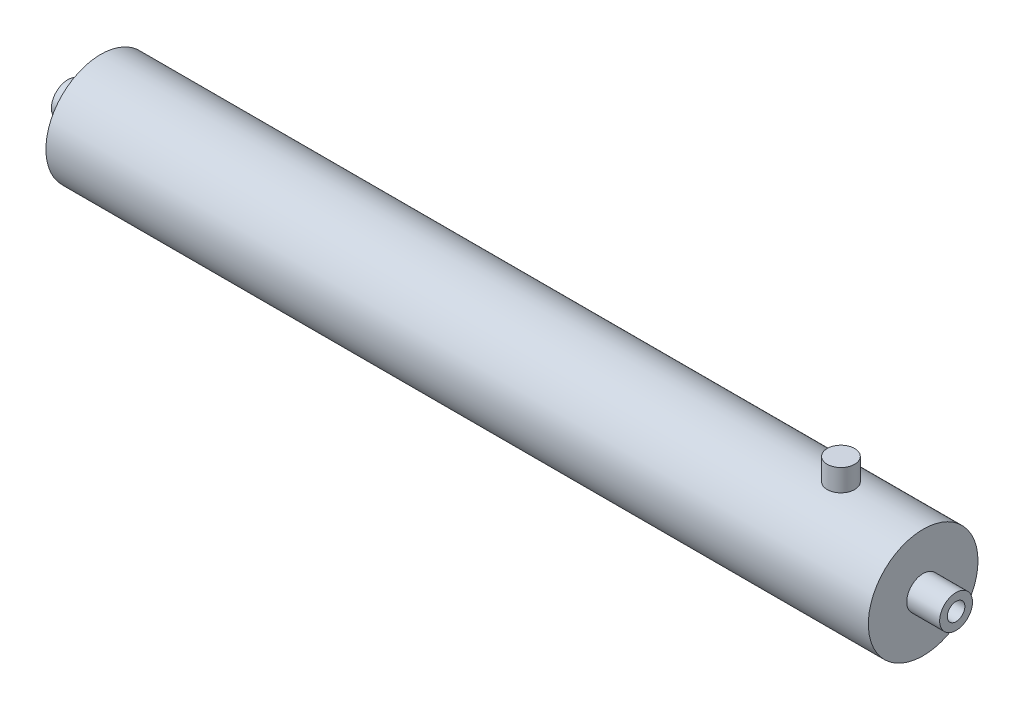
ISO-10303-21;
HEADER;
FILE_DESCRIPTION(('STEP AP214'),'2;1');
FILE_NAME('part.step','',(''),(''),'','','');
FILE_SCHEMA(('AUTOMOTIVE_DESIGN { 1 0 10303 214 1 1 1 1 }'));
ENDSEC;
DATA;
#1=APPLICATION_CONTEXT('core data for automotive mechanical design processes');
#2=APPLICATION_PROTOCOL_DEFINITION('international standard','automotive_design',2000,#1);
#3=PRODUCT_CONTEXT('',#1,'mechanical');
#4=PRODUCT('Part','Part','',(#3));
#5=PRODUCT_RELATED_PRODUCT_CATEGORY('part','',(#4));
#6=PRODUCT_DEFINITION_FORMATION('','',#4);
#7=PRODUCT_DEFINITION_CONTEXT('part definition',#1,'design');
#8=PRODUCT_DEFINITION('design','',#6,#7);
#9=PRODUCT_DEFINITION_SHAPE('','',#8);
#10=(LENGTH_UNIT() NAMED_UNIT(*) SI_UNIT(.MILLI.,.METRE.));
#11=(NAMED_UNIT(*) PLANE_ANGLE_UNIT() SI_UNIT($,.RADIAN.));
#12=(NAMED_UNIT(*) SI_UNIT($,.STERADIAN.) SOLID_ANGLE_UNIT());
#13=UNCERTAINTY_MEASURE_WITH_UNIT(LENGTH_MEASURE(1.E-05),#10,'distance_accuracy_value','');
#14=(GEOMETRIC_REPRESENTATION_CONTEXT(3) GLOBAL_UNCERTAINTY_ASSIGNED_CONTEXT((#13)) GLOBAL_UNIT_ASSIGNED_CONTEXT((#10,
#11,#12)) REPRESENTATION_CONTEXT('',''));
#15=CARTESIAN_POINT('',(0.,0.,0.));
#16=DIRECTION('',(0.,0.,1.));
#17=DIRECTION('',(1.,0.,0.));
#18=AXIS2_PLACEMENT_3D('',#15,#16,#17);
#19=CARTESIAN_POINT('',(120.,28.,0.));
#20=DIRECTION('',(0.,-1.,0.));
#21=DIRECTION('',(0.,0.,-1.));
#22=AXIS2_PLACEMENT_3D('',#19,#20,#21);
#23=CYLINDRICAL_SURFACE('',#22,5.);
#24=CARTESIAN_POINT('',(120.,28.,0.));
#25=DIRECTION('',(0.,1.,0.));
#26=DIRECTION('',(0.,0.,1.));
#27=AXIS2_PLACEMENT_3D('',#24,#25,#26);
#28=CIRCLE('',#27,5.);
#29=CARTESIAN_POINT('',(120.,28.,5.));
#30=VERTEX_POINT('',#29);
#31=EDGE_CURVE('E11',#30,#30,#28,.T.);
#32=ORIENTED_EDGE('',*,*,#31,.F.);
#33=EDGE_LOOP('',(#32));
#34=FACE_BOUND('',#33,.T.);
#35=CARTESIAN_POINT('',(120.,20.,0.));
#36=DIRECTION('',(0.,1.,0.));
#37=DIRECTION('',(0.,0.,1.));
#38=AXIS2_PLACEMENT_3D('',#35,#36,#37);
#39=CIRCLE('',#38,5.);
#40=CARTESIAN_POINT('',(120.,20.,5.));
#41=VERTEX_POINT('',#40);
#42=EDGE_CURVE('E53',#41,#41,#39,.T.);
#43=ORIENTED_EDGE('',*,*,#42,.T.);
#44=EDGE_LOOP('',(#43));
#45=FACE_BOUND('',#44,.T.);
#46=ADVANCED_FACE('F51',(#34,#45),#23,.T.);
#47=CARTESIAN_POINT('',(120.,28.,0.));
#48=DIRECTION('',(0.,1.,0.));
#49=DIRECTION('',(0.,0.,1.));
#50=AXIS2_PLACEMENT_3D('',#47,#48,#49);
#51=PLANE('',#50);
#52=ORIENTED_EDGE('',*,*,#31,.T.);
#53=EDGE_LOOP('',(#52));
#54=FACE_BOUND('',#53,.T.);
#55=ADVANCED_FACE('F66',(#54),#51,.T.);
#56=CARTESIAN_POINT('',(120.,20.,0.));
#57=DIRECTION('',(0.,1.,0.));
#58=DIRECTION('',(0.,0.,1.));
#59=AXIS2_PLACEMENT_3D('',#56,#57,#58);
#60=PLANE('',#59);
#61=ORIENTED_EDGE('',*,*,#42,.F.);
#62=EDGE_LOOP('',(#61));
#63=FACE_BOUND('',#62,.T.);
#64=ADVANCED_FACE('F63',(#63),#60,.F.);
#65=CLOSED_SHELL('',(#46,#55,#64));
#66=MANIFOLD_SOLID_BREP('B2',#65);
#67=CARTESIAN_POINT('',(150.,0.,0.));
#68=DIRECTION('',(-1.,0.,0.));
#69=DIRECTION('',(0.,0.,1.));
#70=AXIS2_PLACEMENT_3D('',#67,#68,#69);
#71=CYLINDRICAL_SURFACE('',#70,20.);
#72=CARTESIAN_POINT('',(150.,0.,0.));
#73=DIRECTION('',(1.,0.,0.));
#74=DIRECTION('',(0.,0.,-1.));
#75=AXIS2_PLACEMENT_3D('',#72,#73,#74);
#76=CIRCLE('',#75,20.);
#77=CARTESIAN_POINT('',(150.,0.,-20.));
#78=VERTEX_POINT('',#77);
#79=EDGE_CURVE('E99',#78,#78,#76,.T.);
#80=ORIENTED_EDGE('',*,*,#79,.F.);
#81=EDGE_LOOP('',(#80));
#82=FACE_BOUND('',#81,.T.);
#83=CARTESIAN_POINT('',(-150.,0.,0.));
#84=DIRECTION('',(1.,0.,0.));
#85=DIRECTION('',(0.,0.,-1.));
#86=AXIS2_PLACEMENT_3D('',#83,#84,#85);
#87=CIRCLE('',#86,20.);
#88=CARTESIAN_POINT('',(-150.,0.,-20.));
#89=VERTEX_POINT('',#88);
#90=EDGE_CURVE('E92',#89,#89,#87,.T.);
#91=ORIENTED_EDGE('',*,*,#90,.T.);
#92=EDGE_LOOP('',(#91));
#93=FACE_BOUND('',#92,.T.);
#94=ADVANCED_FACE('F95',(#82,#93),#71,.T.);
#95=CARTESIAN_POINT('',(150.,0.,0.));
#96=DIRECTION('',(1.,0.,0.));
#97=DIRECTION('',(0.,0.,-1.));
#98=AXIS2_PLACEMENT_3D('',#95,#96,#97);
#99=PLANE('',#98);
#100=CARTESIAN_POINT('',(150.,0.,0.));
#101=DIRECTION('',(1.,0.,0.));
#102=DIRECTION('',(0.,0.,-1.));
#103=AXIS2_PLACEMENT_3D('',#100,#101,#102);
#104=CIRCLE('',#103,6.);
#105=CARTESIAN_POINT('',(150.,0.,-6.));
#106=VERTEX_POINT('',#105);
#107=EDGE_CURVE('E49',#106,#106,#104,.T.);
#108=ORIENTED_EDGE('',*,*,#107,.F.);
#109=EDGE_LOOP('',(#108));
#110=FACE_BOUND('',#109,.T.);
#111=ORIENTED_EDGE('',*,*,#79,.T.);
#112=EDGE_LOOP('',(#111));
#113=FACE_BOUND('',#112,.T.);
#114=ADVANCED_FACE('F144',(#110,#113),#99,.T.);
#115=CARTESIAN_POINT('',(-150.,0.,0.));
#116=DIRECTION('',(1.,0.,0.));
#117=DIRECTION('',(0.,0.,-1.));
#118=AXIS2_PLACEMENT_3D('',#115,#116,#117);
#119=PLANE('',#118);
#120=CARTESIAN_POINT('',(-150.,0.,0.));
#121=DIRECTION('',(1.,0.,0.));
#122=DIRECTION('',(0.,0.,-1.));
#123=AXIS2_PLACEMENT_3D('',#120,#121,#122);
#124=CIRCLE('',#123,6.);
#125=CARTESIAN_POINT('',(-150.,0.,-6.));
#126=VERTEX_POINT('',#125);
#127=EDGE_CURVE('E118',#126,#126,#124,.T.);
#128=ORIENTED_EDGE('',*,*,#127,.T.);
#129=EDGE_LOOP('',(#128));
#130=FACE_BOUND('',#129,.T.);
#131=ORIENTED_EDGE('',*,*,#90,.F.);
#132=EDGE_LOOP('',(#131));
#133=FACE_BOUND('',#132,.T.);
#134=ADVANCED_FACE('F143',(#130,#133),#119,.F.);
#135=CARTESIAN_POINT('',(-150.,0.,0.));
#136=DIRECTION('',(-1.,0.,0.));
#137=DIRECTION('',(0.,0.,1.));
#138=AXIS2_PLACEMENT_3D('',#135,#136,#137);
#139=CYLINDRICAL_SURFACE('',#138,6.);
#140=ORIENTED_EDGE('',*,*,#127,.F.);
#141=EDGE_LOOP('',(#140));
#142=FACE_BOUND('',#141,.T.);
#143=CARTESIAN_POINT('',(-162.,0.,0.));
#144=DIRECTION('',(1.,0.,0.));
#145=DIRECTION('',(0.,0.,-1.));
#146=AXIS2_PLACEMENT_3D('',#143,#144,#145);
#147=CIRCLE('',#146,6.);
#148=CARTESIAN_POINT('',(-162.,0.,-6.));
#149=VERTEX_POINT('',#148);
#150=EDGE_CURVE('E111',#149,#149,#147,.T.);
#151=ORIENTED_EDGE('',*,*,#150,.T.);
#152=EDGE_LOOP('',(#151));
#153=FACE_BOUND('',#152,.T.);
#154=ADVANCED_FACE('F130',(#142,#153),#139,.T.);
#155=CARTESIAN_POINT('',(-162.,0.,0.));
#156=DIRECTION('',(1.,0.,0.));
#157=DIRECTION('',(0.,0.,-1.));
#158=AXIS2_PLACEMENT_3D('',#155,#156,#157);
#159=PLANE('',#158);
#160=CARTESIAN_POINT('',(-162.,0.,0.));
#161=DIRECTION('',(1.,0.,0.));
#162=DIRECTION('',(0.,0.,-1.));
#163=AXIS2_PLACEMENT_3D('',#160,#161,#162);
#164=CIRCLE('',#163,3.2);
#165=CARTESIAN_POINT('',(-162.,0.,-3.2));
#166=VERTEX_POINT('',#165);
#167=EDGE_CURVE('E113',#166,#166,#164,.T.);
#168=ORIENTED_EDGE('',*,*,#167,.T.);
#169=EDGE_LOOP('',(#168));
#170=FACE_BOUND('',#169,.T.);
#171=ORIENTED_EDGE('',*,*,#150,.F.);
#172=EDGE_LOOP('',(#171));
#173=FACE_BOUND('',#172,.T.);
#174=ADVANCED_FACE('F129',(#170,#173),#159,.F.);
#175=CARTESIAN_POINT('',(-152.,0.,0.));
#176=DIRECTION('',(-1.,0.,0.));
#177=DIRECTION('',(0.,0.,1.));
#178=AXIS2_PLACEMENT_3D('',#175,#176,#177);
#179=CYLINDRICAL_SURFACE('',#178,3.2);
#180=CARTESIAN_POINT('',(-152.,0.,0.));
#181=DIRECTION('',(1.,0.,0.));
#182=DIRECTION('',(0.,0.,-1.));
#183=AXIS2_PLACEMENT_3D('',#180,#181,#182);
#184=CIRCLE('',#183,3.2);
#185=CARTESIAN_POINT('',(-152.,0.,-3.2));
#186=VERTEX_POINT('',#185);
#187=EDGE_CURVE('E109',#186,#186,#184,.T.);
#188=ORIENTED_EDGE('',*,*,#187,.T.);
#189=EDGE_LOOP('',(#188));
#190=FACE_BOUND('',#189,.T.);
#191=ORIENTED_EDGE('',*,*,#167,.F.);
#192=EDGE_LOOP('',(#191));
#193=FACE_BOUND('',#192,.T.);
#194=ADVANCED_FACE('F131',(#190,#193),#179,.F.);
#195=CARTESIAN_POINT('',(-152.,0.,0.));
#196=DIRECTION('',(1.,0.,0.));
#197=DIRECTION('',(0.,0.,-1.));
#198=AXIS2_PLACEMENT_3D('',#195,#196,#197);
#199=PLANE('',#198);
#200=ORIENTED_EDGE('',*,*,#187,.F.);
#201=EDGE_LOOP('',(#200));
#202=FACE_BOUND('',#201,.T.);
#203=ADVANCED_FACE('F137',(#202),#199,.F.);
#204=CARTESIAN_POINT('',(162.,0.,0.));
#205=DIRECTION('',(-1.,0.,0.));
#206=DIRECTION('',(0.,0.,1.));
#207=AXIS2_PLACEMENT_3D('',#204,#205,#206);
#208=CYLINDRICAL_SURFACE('',#207,6.);
#209=CARTESIAN_POINT('',(162.,0.,0.));
#210=DIRECTION('',(1.,0.,0.));
#211=DIRECTION('',(0.,0.,-1.));
#212=AXIS2_PLACEMENT_3D('',#209,#210,#211);
#213=CIRCLE('',#212,6.);
#214=CARTESIAN_POINT('',(162.,0.,-6.));
#215=VERTEX_POINT('',#214);
#216=EDGE_CURVE('E107',#215,#215,#213,.T.);
#217=ORIENTED_EDGE('',*,*,#216,.F.);
#218=EDGE_LOOP('',(#217));
#219=FACE_BOUND('',#218,.T.);
#220=ORIENTED_EDGE('',*,*,#107,.T.);
#221=EDGE_LOOP('',(#220));
#222=FACE_BOUND('',#221,.T.);
#223=ADVANCED_FACE('F190',(#219,#222),#208,.T.);
#224=CARTESIAN_POINT('',(162.,0.,0.));
#225=DIRECTION('',(1.,0.,0.));
#226=DIRECTION('',(0.,0.,-1.));
#227=AXIS2_PLACEMENT_3D('',#224,#225,#226);
#228=PLANE('',#227);
#229=CARTESIAN_POINT('',(162.,0.,0.));
#230=DIRECTION('',(1.,0.,0.));
#231=DIRECTION('',(0.,0.,-1.));
#232=AXIS2_PLACEMENT_3D('',#229,#230,#231);
#233=CIRCLE('',#232,3.2);
#234=CARTESIAN_POINT('',(162.,0.,-3.2));
#235=VERTEX_POINT('',#234);
#236=EDGE_CURVE('E237',#235,#235,#233,.T.);
#237=ORIENTED_EDGE('',*,*,#236,.F.);
#238=EDGE_LOOP('',(#237));
#239=FACE_BOUND('',#238,.T.);
#240=ORIENTED_EDGE('',*,*,#216,.T.);
#241=EDGE_LOOP('',(#240));
#242=FACE_BOUND('',#241,.T.);
#243=ADVANCED_FACE('F199',(#239,#242),#228,.T.);
#244=CARTESIAN_POINT('',(152.,0.,0.));
#245=DIRECTION('',(1.,0.,0.));
#246=DIRECTION('',(0.,0.,-1.));
#247=AXIS2_PLACEMENT_3D('',#244,#245,#246);
#248=CYLINDRICAL_SURFACE('',#247,3.2);
#249=CARTESIAN_POINT('',(152.,0.,0.));
#250=DIRECTION('',(1.,0.,0.));
#251=DIRECTION('',(0.,0.,-1.));
#252=AXIS2_PLACEMENT_3D('',#249,#250,#251);
#253=CIRCLE('',#252,3.2);
#254=CARTESIAN_POINT('',(152.,0.,-3.2));
#255=VERTEX_POINT('',#254);
#256=EDGE_CURVE('E233',#255,#255,#253,.T.);
#257=ORIENTED_EDGE('',*,*,#256,.F.);
#258=EDGE_LOOP('',(#257));
#259=FACE_BOUND('',#258,.T.);
#260=ORIENTED_EDGE('',*,*,#236,.T.);
#261=EDGE_LOOP('',(#260));
#262=FACE_BOUND('',#261,.T.);
#263=ADVANCED_FACE('F209',(#259,#262),#248,.F.);
#264=CARTESIAN_POINT('',(152.,0.,0.));
#265=DIRECTION('',(1.,0.,0.));
#266=DIRECTION('',(0.,0.,-1.));
#267=AXIS2_PLACEMENT_3D('',#264,#265,#266);
#268=PLANE('',#267);
#269=ORIENTED_EDGE('',*,*,#256,.T.);
#270=EDGE_LOOP('',(#269));
#271=FACE_BOUND('',#270,.T.);
#272=ADVANCED_FACE('F219',(#271),#268,.T.);
#273=CLOSED_SHELL('',(#94,#114,#134,#154,#174,#194,#203,#223,#243,#263,#272));
#274=MANIFOLD_SOLID_BREP('B6',#273);
#275=ADVANCED_BREP_SHAPE_REPRESENTATION('',(#18,#66,#274),#14);
#276=SHAPE_DEFINITION_REPRESENTATION(#9,#275);
ENDSEC;
END-ISO-10303-21;
